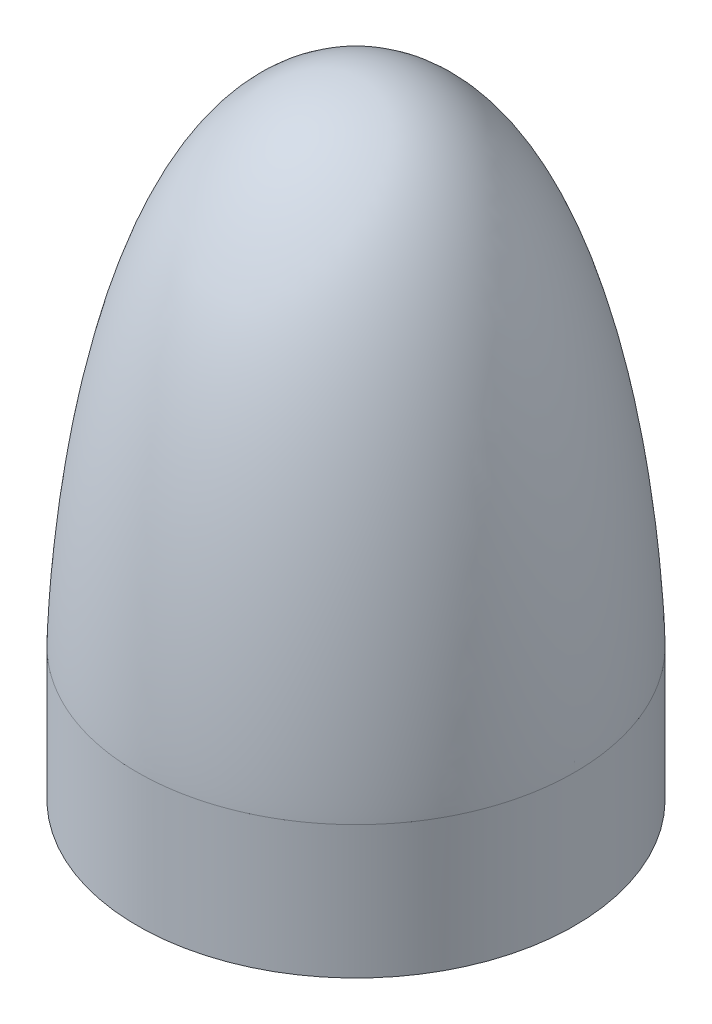
ISO-10303-21;
HEADER;
FILE_DESCRIPTION(('STEP AP214'),'2;1');
FILE_NAME('part.step','',(''),(''),'','','');
FILE_SCHEMA(('AUTOMOTIVE_DESIGN { 1 0 10303 214 1 1 1 1 }'));
ENDSEC;
DATA;
#1=APPLICATION_CONTEXT('core data for automotive mechanical design processes');
#2=APPLICATION_PROTOCOL_DEFINITION('international standard','automotive_design',2000,#1);
#3=PRODUCT_CONTEXT('',#1,'mechanical');
#4=PRODUCT('Part','Part','',(#3));
#5=PRODUCT_RELATED_PRODUCT_CATEGORY('part','',(#4));
#6=PRODUCT_DEFINITION_FORMATION('','',#4);
#7=PRODUCT_DEFINITION_CONTEXT('part definition',#1,'design');
#8=PRODUCT_DEFINITION('design','',#6,#7);
#9=PRODUCT_DEFINITION_SHAPE('','',#8);
#10=(LENGTH_UNIT() NAMED_UNIT(*) SI_UNIT(.MILLI.,.METRE.));
#11=(NAMED_UNIT(*) PLANE_ANGLE_UNIT() SI_UNIT($,.RADIAN.));
#12=(NAMED_UNIT(*) SI_UNIT($,.STERADIAN.) SOLID_ANGLE_UNIT());
#13=UNCERTAINTY_MEASURE_WITH_UNIT(LENGTH_MEASURE(1.E-05),#10,'distance_accuracy_value','');
#14=(GEOMETRIC_REPRESENTATION_CONTEXT(3) GLOBAL_UNCERTAINTY_ASSIGNED_CONTEXT((#13)) GLOBAL_UNIT_ASSIGNED_CONTEXT((#10,
#11,#12)) REPRESENTATION_CONTEXT('',''));
#15=CARTESIAN_POINT('',(0.,0.,0.));
#16=DIRECTION('',(0.,0.,1.));
#17=DIRECTION('',(1.,0.,0.));
#18=AXIS2_PLACEMENT_3D('',#15,#16,#17);
#19=CARTESIAN_POINT('',(0.,-7.91303002861502,1.63207319706783E-06));
#20=DIRECTION('',(0.,-1.,0.));
#21=DIRECTION('',(0.,0.,-1.));
#22=AXIS2_PLACEMENT_3D('',#19,#20,#21);
#23=PLANE('',#22);
#24=CARTESIAN_POINT('',(0.,-7.91303002861502,1.63207319706783E-06));
#25=DIRECTION('',(0.,-1.,0.));
#26=DIRECTION('',(0.,0.,-1.));
#27=AXIS2_PLACEMENT_3D('',#24,#25,#26);
#28=CIRCLE('',#27,14.);
#29=CARTESIAN_POINT('',(0.,-7.91303002861502,-13.9999983679268));
#30=VERTEX_POINT('',#29);
#31=EDGE_CURVE('E11',#30,#30,#28,.T.);
#32=ORIENTED_EDGE('',*,*,#31,.T.);
#33=EDGE_LOOP('',(#32));
#34=FACE_BOUND('',#33,.T.);
#35=ADVANCED_FACE('F35',(#34),#23,.T.);
#36=CARTESIAN_POINT('',(0.,-7.91303002861502,1.63207319706783E-06));
#37=DIRECTION('',(0.,-1.,0.));
#38=DIRECTION('',(0.,0.,-1.));
#39=AXIS2_PLACEMENT_3D('',#36,#37,#38);
#40=CYLINDRICAL_SURFACE('',#39,14.);
#41=CARTESIAN_POINT('',(0.,0.599554023441105,1.63207319706783E-06));
#42=DIRECTION('',(0.,-1.,0.));
#43=DIRECTION('',(0.,0.,-1.));
#44=AXIS2_PLACEMENT_3D('',#41,#42,#43);
#45=CIRCLE('',#44,14.);
#46=CARTESIAN_POINT('',(0.,0.599554023441105,-13.9999983679268));
#47=VERTEX_POINT('',#46);
#48=EDGE_CURVE('E41',#47,#47,#45,.T.);
#49=ORIENTED_EDGE('',*,*,#48,.T.);
#50=EDGE_LOOP('',(#49));
#51=FACE_BOUND('',#50,.T.);
#52=ORIENTED_EDGE('',*,*,#31,.F.);
#53=EDGE_LOOP('',(#52));
#54=FACE_BOUND('',#53,.T.);
#55=ADVANCED_FACE('F47',(#51,#54),#40,.T.);
#56=CARTESIAN_POINT('',(14.,0.599554023441091,1.63207319706783E-06));
#57=CARTESIAN_POINT('',(14.0101192378029,0.600297963765106,1.63207319706783E-06));
#58=CARTESIAN_POINT('',(13.497519718667,32.0535501950033,1.63207319706783E-06));
#59=CARTESIAN_POINT('',(0.,32.086969971385,1.63207319706783E-06));
#60=B_SPLINE_CURVE_WITH_KNOTS('',3,(#56,#57,#58,#59),.UNSPECIFIED.,.F.,.F.,(4,4),(0.,
0.166417438268429),.UNSPECIFIED.);
#61=CARTESIAN_POINT('',(0.,-7.91303002861502,1.63207319706783E-06));
#62=DIRECTION('',(0.,-1.,0.));
#63=AXIS1_PLACEMENT('',#61,#62);
#64=SURFACE_OF_REVOLUTION('',#60,#63);
#65=CARTESIAN_POINT('',(0.,32.086969971385,1.63207319706783E-06));
#66=VERTEX_POINT('',#65);
#67=VERTEX_LOOP('',#66);
#68=FACE_BOUND('',#67,.T.);
#69=ORIENTED_EDGE('',*,*,#48,.F.);
#70=EDGE_LOOP('',(#69));
#71=FACE_BOUND('',#70,.T.);
#72=ADVANCED_FACE('F44',(#68,#71),#64,.F.);
#73=CLOSED_SHELL('',(#35,#55,#72));
#74=MANIFOLD_SOLID_BREP('B2',#73);
#75=ADVANCED_BREP_SHAPE_REPRESENTATION('',(#18,#74),#14);
#76=SHAPE_DEFINITION_REPRESENTATION(#9,#75);
ENDSEC;
END-ISO-10303-21;
